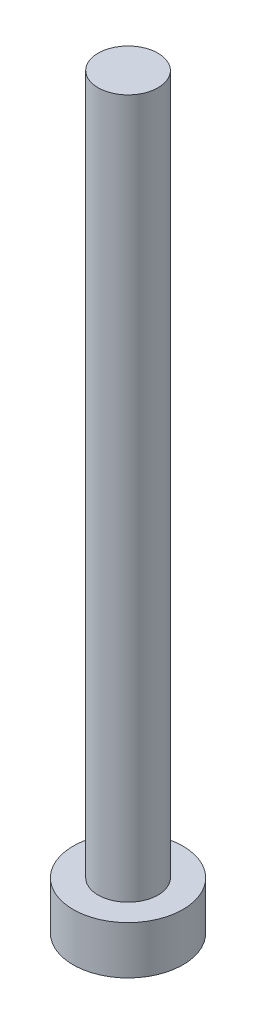
ISO-10303-21;
HEADER;
FILE_DESCRIPTION(('STEP AP214'),'2;1');
FILE_NAME('part.step','',(''),(''),'','','');
FILE_SCHEMA(('AUTOMOTIVE_DESIGN { 1 0 10303 214 1 1 1 1 }'));
ENDSEC;
DATA;
#1=APPLICATION_CONTEXT('core data for automotive mechanical design processes');
#2=APPLICATION_PROTOCOL_DEFINITION('international standard','automotive_design',2000,#1);
#3=PRODUCT_CONTEXT('',#1,'mechanical');
#4=PRODUCT('Part','Part','',(#3));
#5=PRODUCT_RELATED_PRODUCT_CATEGORY('part','',(#4));
#6=PRODUCT_DEFINITION_FORMATION('','',#4);
#7=PRODUCT_DEFINITION_CONTEXT('part definition',#1,'design');
#8=PRODUCT_DEFINITION('design','',#6,#7);
#9=PRODUCT_DEFINITION_SHAPE('','',#8);
#10=(LENGTH_UNIT() NAMED_UNIT(*) SI_UNIT(.MILLI.,.METRE.));
#11=(NAMED_UNIT(*) PLANE_ANGLE_UNIT() SI_UNIT($,.RADIAN.));
#12=(NAMED_UNIT(*) SI_UNIT($,.STERADIAN.) SOLID_ANGLE_UNIT());
#13=UNCERTAINTY_MEASURE_WITH_UNIT(LENGTH_MEASURE(1.E-05),#10,'distance_accuracy_value','');
#14=(GEOMETRIC_REPRESENTATION_CONTEXT(3) GLOBAL_UNCERTAINTY_ASSIGNED_CONTEXT((#13)) GLOBAL_UNIT_ASSIGNED_CONTEXT((#10,
#11,#12)) REPRESENTATION_CONTEXT('',''));
#15=CARTESIAN_POINT('',(0.,0.,0.));
#16=DIRECTION('',(0.,0.,1.));
#17=DIRECTION('',(1.,0.,0.));
#18=AXIS2_PLACEMENT_3D('',#15,#16,#17);
#19=CARTESIAN_POINT('',(0.,-2.4,-2.75));
#20=DIRECTION('',(0.,-1.,0.));
#21=DIRECTION('',(0.,0.,-1.));
#22=AXIS2_PLACEMENT_3D('',#19,#20,#21);
#23=PLANE('',#22);
#24=CARTESIAN_POINT('',(0.,-2.4,0.));
#25=DIRECTION('',(0.,-1.,0.));
#26=DIRECTION('',(0.,0.,-1.));
#27=AXIS2_PLACEMENT_3D('',#24,#25,#26);
#28=CIRCLE('',#27,2.75);
#29=CARTESIAN_POINT('',(0.,-2.4,-2.75));
#30=VERTEX_POINT('',#29);
#31=EDGE_CURVE('E45',#30,#30,#28,.T.);
#32=ORIENTED_EDGE('',*,*,#31,.T.);
#33=EDGE_LOOP('',(#32));
#34=FACE_BOUND('',#33,.T.);
#35=ADVANCED_FACE('F31',(#34),#23,.T.);
#36=CARTESIAN_POINT('',(0.,35.,0.));
#37=DIRECTION('',(0.,1.,0.));
#38=DIRECTION('',(0.,0.,1.));
#39=AXIS2_PLACEMENT_3D('',#36,#37,#38);
#40=PLANE('',#39);
#41=CARTESIAN_POINT('',(0.,35.,0.));
#42=DIRECTION('',(0.,-1.,0.));
#43=DIRECTION('',(0.,0.,-1.));
#44=AXIS2_PLACEMENT_3D('',#41,#42,#43);
#45=CIRCLE('',#44,1.5);
#46=CARTESIAN_POINT('',(0.,35.,-1.5));
#47=VERTEX_POINT('',#46);
#48=EDGE_CURVE('E10',#47,#47,#45,.T.);
#49=ORIENTED_EDGE('',*,*,#48,.F.);
#50=EDGE_LOOP('',(#49));
#51=FACE_BOUND('',#50,.T.);
#52=ADVANCED_FACE('F63',(#51),#40,.T.);
#53=CARTESIAN_POINT('',(0.,0.,0.));
#54=DIRECTION('',(0.,-1.,0.));
#55=DIRECTION('',(0.,0.,-1.));
#56=AXIS2_PLACEMENT_3D('',#53,#54,#55);
#57=CYLINDRICAL_SURFACE('',#56,1.5);
#58=ORIENTED_EDGE('',*,*,#48,.T.);
#59=EDGE_LOOP('',(#58));
#60=FACE_BOUND('',#59,.T.);
#61=CARTESIAN_POINT('',(0.,0.,0.));
#62=DIRECTION('',(0.,-1.,0.));
#63=DIRECTION('',(0.,0.,-1.));
#64=AXIS2_PLACEMENT_3D('',#61,#62,#63);
#65=CIRCLE('',#64,1.5);
#66=CARTESIAN_POINT('',(0.,0.,-1.5));
#67=VERTEX_POINT('',#66);
#68=EDGE_CURVE('E37',#67,#67,#65,.T.);
#69=ORIENTED_EDGE('',*,*,#68,.F.);
#70=EDGE_LOOP('',(#69));
#71=FACE_BOUND('',#70,.T.);
#72=ADVANCED_FACE('F60',(#60,#71),#57,.T.);
#73=CARTESIAN_POINT('',(0.,0.,-1.5));
#74=DIRECTION('',(0.,1.,0.));
#75=DIRECTION('',(0.,0.,1.));
#76=AXIS2_PLACEMENT_3D('',#73,#74,#75);
#77=PLANE('',#76);
#78=ORIENTED_EDGE('',*,*,#68,.T.);
#79=EDGE_LOOP('',(#78));
#80=FACE_BOUND('',#79,.T.);
#81=CARTESIAN_POINT('',(0.,0.,0.));
#82=DIRECTION('',(0.,-1.,0.));
#83=DIRECTION('',(0.,0.,-1.));
#84=AXIS2_PLACEMENT_3D('',#81,#82,#83);
#85=CIRCLE('',#84,2.75);
#86=CARTESIAN_POINT('',(0.,0.,-2.75));
#87=VERTEX_POINT('',#86);
#88=EDGE_CURVE('E41',#87,#87,#85,.T.);
#89=ORIENTED_EDGE('',*,*,#88,.F.);
#90=EDGE_LOOP('',(#89));
#91=FACE_BOUND('',#90,.T.);
#92=ADVANCED_FACE('F54',(#80,#91),#77,.T.);
#93=CARTESIAN_POINT('',(0.,0.,0.));
#94=DIRECTION('',(0.,-1.,0.));
#95=DIRECTION('',(0.,0.,-1.));
#96=AXIS2_PLACEMENT_3D('',#93,#94,#95);
#97=CYLINDRICAL_SURFACE('',#96,2.75);
#98=ORIENTED_EDGE('',*,*,#88,.T.);
#99=EDGE_LOOP('',(#98));
#100=FACE_BOUND('',#99,.T.);
#101=ORIENTED_EDGE('',*,*,#31,.F.);
#102=EDGE_LOOP('',(#101));
#103=FACE_BOUND('',#102,.T.);
#104=ADVANCED_FACE('F52',(#100,#103),#97,.T.);
#105=CLOSED_SHELL('',(#35,#52,#72,#92,#104));
#106=MANIFOLD_SOLID_BREP('B2',#105);
#107=ADVANCED_BREP_SHAPE_REPRESENTATION('',(#18,#106),#14);
#108=SHAPE_DEFINITION_REPRESENTATION(#9,#107);
ENDSEC;
END-ISO-10303-21;
